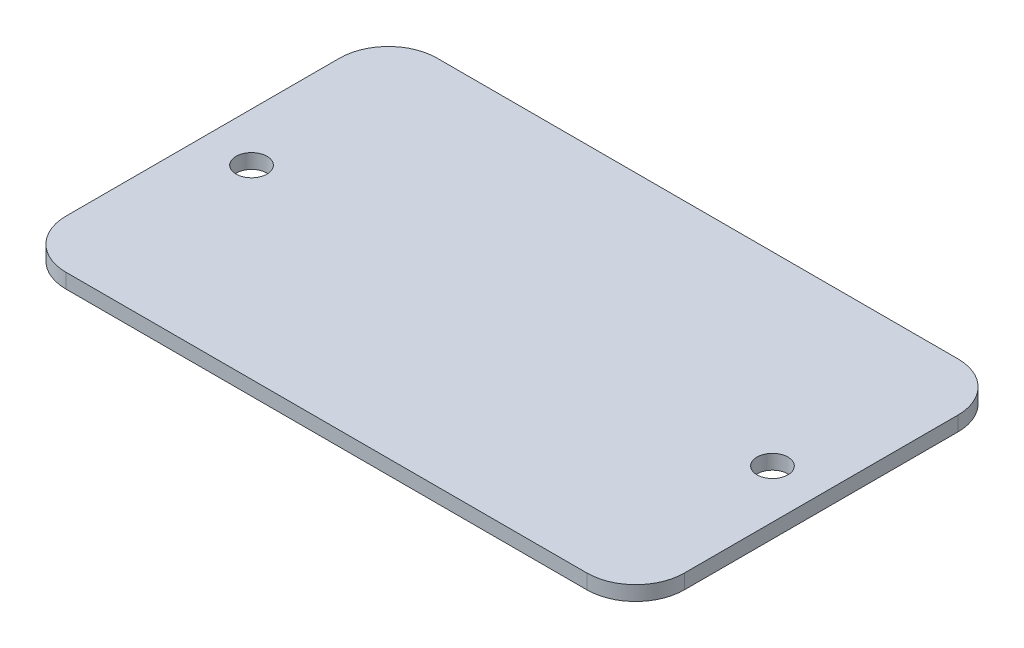
ISO-10303-21;
HEADER;
FILE_DESCRIPTION(('STEP AP214'),'2;1');
FILE_NAME('part.step','',(''),(''),'','','');
FILE_SCHEMA(('AUTOMOTIVE_DESIGN { 1 0 10303 214 1 1 1 1 }'));
ENDSEC;
DATA;
#1=APPLICATION_CONTEXT('core data for automotive mechanical design processes');
#2=APPLICATION_PROTOCOL_DEFINITION('international standard','automotive_design',2000,#1);
#3=PRODUCT_CONTEXT('',#1,'mechanical');
#4=PRODUCT('Part','Part','',(#3));
#5=PRODUCT_RELATED_PRODUCT_CATEGORY('part','',(#4));
#6=PRODUCT_DEFINITION_FORMATION('','',#4);
#7=PRODUCT_DEFINITION_CONTEXT('part definition',#1,'design');
#8=PRODUCT_DEFINITION('design','',#6,#7);
#9=PRODUCT_DEFINITION_SHAPE('','',#8);
#10=(LENGTH_UNIT() NAMED_UNIT(*) SI_UNIT(.MILLI.,.METRE.));
#11=(NAMED_UNIT(*) PLANE_ANGLE_UNIT() SI_UNIT($,.RADIAN.));
#12=(NAMED_UNIT(*) SI_UNIT($,.STERADIAN.) SOLID_ANGLE_UNIT());
#13=UNCERTAINTY_MEASURE_WITH_UNIT(LENGTH_MEASURE(1.E-05),#10,'distance_accuracy_value','');
#14=(GEOMETRIC_REPRESENTATION_CONTEXT(3) GLOBAL_UNCERTAINTY_ASSIGNED_CONTEXT((#13)) GLOBAL_UNIT_ASSIGNED_CONTEXT((#10,
#11,#12)) REPRESENTATION_CONTEXT('',''));
#15=CARTESIAN_POINT('',(0.,0.,0.));
#16=DIRECTION('',(0.,0.,1.));
#17=DIRECTION('',(1.,0.,0.));
#18=AXIS2_PLACEMENT_3D('',#15,#16,#17);
#19=CARTESIAN_POINT('',(53.5,3.,-28.1));
#20=DIRECTION('',(0.,-1.,0.));
#21=DIRECTION('',(0.,0.,-1.));
#22=AXIS2_PLACEMENT_3D('',#19,#20,#21);
#23=CYLINDRICAL_SURFACE('',#22,10.);
#24=CARTESIAN_POINT('',(53.5,0.,-28.1));
#25=DIRECTION('',(0.,1.,0.));
#26=DIRECTION('',(0.,0.,-1.));
#27=AXIS2_PLACEMENT_3D('',#24,#25,#26);
#28=CIRCLE('',#27,10.);
#29=CARTESIAN_POINT('',(63.5,0.,-28.0999999999999));
#30=VERTEX_POINT('',#29);
#31=CARTESIAN_POINT('',(53.4999999999999,0.,-38.1));
#32=VERTEX_POINT('',#31);
#33=EDGE_CURVE('E129',#30,#32,#28,.T.);
#34=ORIENTED_EDGE('',*,*,#33,.T.);
#35=DIRECTION('',(0.,-1.,0.));
#36=VECTOR('',#35,1.);
#37=CARTESIAN_POINT('',(53.4999999999999,3.,-38.1));
#38=LINE('',#37,#36);
#39=CARTESIAN_POINT('',(53.4999999999999,3.,-38.1));
#40=VERTEX_POINT('',#39);
#41=EDGE_CURVE('E11',#40,#32,#38,.T.);
#42=ORIENTED_EDGE('',*,*,#41,.F.);
#43=CARTESIAN_POINT('',(53.5,3.,-28.1));
#44=DIRECTION('',(0.,1.,0.));
#45=DIRECTION('',(0.,0.,-1.));
#46=AXIS2_PLACEMENT_3D('',#43,#44,#45);
#47=CIRCLE('',#46,10.);
#48=CARTESIAN_POINT('',(63.5,3.,-28.0999999999999));
#49=VERTEX_POINT('',#48);
#50=EDGE_CURVE('E144',#49,#40,#47,.T.);
#51=ORIENTED_EDGE('',*,*,#50,.F.);
#52=DIRECTION('',(0.,-1.,0.));
#53=VECTOR('',#52,1.);
#54=CARTESIAN_POINT('',(63.5,3.,-28.0999999999999));
#55=LINE('',#54,#53);
#56=EDGE_CURVE('E125',#49,#30,#55,.T.);
#57=ORIENTED_EDGE('',*,*,#56,.T.);
#58=EDGE_LOOP('',(#34,#42,#51,#57));
#59=FACE_BOUND('',#58,.T.);
#60=ADVANCED_FACE('F33',(#59),#23,.T.);
#61=CARTESIAN_POINT('',(-53.5,3.,-38.1));
#62=DIRECTION('',(0.,0.,1.));
#63=DIRECTION('',(1.,0.,0.));
#64=AXIS2_PLACEMENT_3D('',#61,#62,#63);
#65=PLANE('',#64);
#66=DIRECTION('',(-1.,0.,0.));
#67=VECTOR('',#66,1.);
#68=CARTESIAN_POINT('',(-53.5,0.,-38.1));
#69=LINE('',#68,#67);
#70=CARTESIAN_POINT('',(-53.5,0.,-38.1));
#71=VERTEX_POINT('',#70);
#72=EDGE_CURVE('E132',#32,#71,#69,.T.);
#73=ORIENTED_EDGE('',*,*,#72,.T.);
#74=DIRECTION('',(0.,-1.,0.));
#75=VECTOR('',#74,1.);
#76=CARTESIAN_POINT('',(-53.5,3.,-38.1));
#77=LINE('',#76,#75);
#78=CARTESIAN_POINT('',(-53.5,3.,-38.1));
#79=VERTEX_POINT('',#78);
#80=EDGE_CURVE('E41',#79,#71,#77,.T.);
#81=ORIENTED_EDGE('',*,*,#80,.F.);
#82=DIRECTION('',(-1.,0.,0.));
#83=VECTOR('',#82,1.);
#84=CARTESIAN_POINT('',(-53.5,3.,-38.1));
#85=LINE('',#84,#83);
#86=EDGE_CURVE('E92',#40,#79,#85,.T.);
#87=ORIENTED_EDGE('',*,*,#86,.F.);
#88=ORIENTED_EDGE('',*,*,#41,.T.);
#89=EDGE_LOOP('',(#73,#81,#87,#88));
#90=FACE_BOUND('',#89,.T.);
#91=ADVANCED_FACE('F213',(#90),#65,.F.);
#92=CARTESIAN_POINT('',(-53.5,3.,-28.1));
#93=DIRECTION('',(0.,-1.,0.));
#94=DIRECTION('',(0.,0.,-1.));
#95=AXIS2_PLACEMENT_3D('',#92,#93,#94);
#96=CYLINDRICAL_SURFACE('',#95,10.);
#97=CARTESIAN_POINT('',(-53.5,0.,-28.1));
#98=DIRECTION('',(0.,1.,0.));
#99=DIRECTION('',(0.,0.,-1.));
#100=AXIS2_PLACEMENT_3D('',#97,#98,#99);
#101=CIRCLE('',#100,10.);
#102=CARTESIAN_POINT('',(-63.5,0.,-28.0999999999999));
#103=VERTEX_POINT('',#102);
#104=EDGE_CURVE('E135',#71,#103,#101,.T.);
#105=ORIENTED_EDGE('',*,*,#104,.T.);
#106=DIRECTION('',(0.,-1.,0.));
#107=VECTOR('',#106,1.);
#108=CARTESIAN_POINT('',(-63.5,3.,-28.0999999999999));
#109=LINE('',#108,#107);
#110=CARTESIAN_POINT('',(-63.5,3.,-28.0999999999999));
#111=VERTEX_POINT('',#110);
#112=EDGE_CURVE('E151',#111,#103,#109,.T.);
#113=ORIENTED_EDGE('',*,*,#112,.F.);
#114=CARTESIAN_POINT('',(-53.5,3.,-28.1));
#115=DIRECTION('',(0.,1.,0.));
#116=DIRECTION('',(0.,0.,-1.));
#117=AXIS2_PLACEMENT_3D('',#114,#115,#116);
#118=CIRCLE('',#117,10.);
#119=EDGE_CURVE('E159',#79,#111,#118,.T.);
#120=ORIENTED_EDGE('',*,*,#119,.F.);
#121=ORIENTED_EDGE('',*,*,#80,.T.);
#122=EDGE_LOOP('',(#105,#113,#120,#121));
#123=FACE_BOUND('',#122,.T.);
#124=ADVANCED_FACE('F157',(#123),#96,.T.);
#125=CARTESIAN_POINT('',(-63.5,3.,28.0999999999999));
#126=DIRECTION('',(1.,0.,0.));
#127=DIRECTION('',(0.,0.,-1.));
#128=AXIS2_PLACEMENT_3D('',#125,#126,#127);
#129=PLANE('',#128);
#130=DIRECTION('',(0.,0.,1.));
#131=VECTOR('',#130,1.);
#132=CARTESIAN_POINT('',(-63.5,0.,28.0999999999999));
#133=LINE('',#132,#131);
#134=CARTESIAN_POINT('',(-63.5,0.,28.0999999999999));
#135=VERTEX_POINT('',#134);
#136=EDGE_CURVE('E137',#103,#135,#133,.T.);
#137=ORIENTED_EDGE('',*,*,#136,.T.);
#138=DIRECTION('',(0.,-1.,0.));
#139=VECTOR('',#138,1.);
#140=CARTESIAN_POINT('',(-63.5,3.,28.0999999999999));
#141=LINE('',#140,#139);
#142=CARTESIAN_POINT('',(-63.5,3.,28.0999999999999));
#143=VERTEX_POINT('',#142);
#144=EDGE_CURVE('E148',#143,#135,#141,.T.);
#145=ORIENTED_EDGE('',*,*,#144,.F.);
#146=DIRECTION('',(0.,0.,1.));
#147=VECTOR('',#146,1.);
#148=CARTESIAN_POINT('',(-63.5,3.,28.0999999999999));
#149=LINE('',#148,#147);
#150=EDGE_CURVE('E171',#111,#143,#149,.T.);
#151=ORIENTED_EDGE('',*,*,#150,.F.);
#152=ORIENTED_EDGE('',*,*,#112,.T.);
#153=EDGE_LOOP('',(#137,#145,#151,#152));
#154=FACE_BOUND('',#153,.T.);
#155=ADVANCED_FACE('F167',(#154),#129,.F.);
#156=CARTESIAN_POINT('',(-53.5,3.,28.1));
#157=DIRECTION('',(0.,-1.,0.));
#158=DIRECTION('',(0.,0.,-1.));
#159=AXIS2_PLACEMENT_3D('',#156,#157,#158);
#160=CYLINDRICAL_SURFACE('',#159,10.);
#161=CARTESIAN_POINT('',(-53.5,0.,28.1));
#162=DIRECTION('',(0.,1.,0.));
#163=DIRECTION('',(0.,0.,-1.));
#164=AXIS2_PLACEMENT_3D('',#161,#162,#163);
#165=CIRCLE('',#164,10.);
#166=CARTESIAN_POINT('',(-53.5,0.,38.1));
#167=VERTEX_POINT('',#166);
#168=EDGE_CURVE('E139',#135,#167,#165,.T.);
#169=ORIENTED_EDGE('',*,*,#168,.T.);
#170=DIRECTION('',(0.,-1.,0.));
#171=VECTOR('',#170,1.);
#172=CARTESIAN_POINT('',(-53.5,3.,38.1));
#173=LINE('',#172,#171);
#174=CARTESIAN_POINT('',(-53.5,3.,38.1));
#175=VERTEX_POINT('',#174);
#176=EDGE_CURVE('E120',#175,#167,#173,.T.);
#177=ORIENTED_EDGE('',*,*,#176,.F.);
#178=CARTESIAN_POINT('',(-53.5,3.,28.1));
#179=DIRECTION('',(0.,1.,0.));
#180=DIRECTION('',(0.,0.,-1.));
#181=AXIS2_PLACEMENT_3D('',#178,#179,#180);
#182=CIRCLE('',#181,10.);
#183=EDGE_CURVE('E111',#143,#175,#182,.T.);
#184=ORIENTED_EDGE('',*,*,#183,.F.);
#185=ORIENTED_EDGE('',*,*,#144,.T.);
#186=EDGE_LOOP('',(#169,#177,#184,#185));
#187=FACE_BOUND('',#186,.T.);
#188=ADVANCED_FACE('F170',(#187),#160,.T.);
#189=CARTESIAN_POINT('',(-53.5,3.,38.1));
#190=DIRECTION('',(0.,0.,-1.));
#191=DIRECTION('',(-1.,0.,0.));
#192=AXIS2_PLACEMENT_3D('',#189,#190,#191);
#193=PLANE('',#192);
#194=DIRECTION('',(1.,0.,0.));
#195=VECTOR('',#194,1.);
#196=CARTESIAN_POINT('',(-53.5,0.,38.1));
#197=LINE('',#196,#195);
#198=CARTESIAN_POINT('',(53.4999999999999,0.,38.1));
#199=VERTEX_POINT('',#198);
#200=EDGE_CURVE('E119',#167,#199,#197,.T.);
#201=ORIENTED_EDGE('',*,*,#200,.T.);
#202=DIRECTION('',(0.,-1.,0.));
#203=VECTOR('',#202,1.);
#204=CARTESIAN_POINT('',(53.4999999999999,3.,38.1));
#205=LINE('',#204,#203);
#206=CARTESIAN_POINT('',(53.4999999999999,3.,38.1));
#207=VERTEX_POINT('',#206);
#208=EDGE_CURVE('E116',#207,#199,#205,.T.);
#209=ORIENTED_EDGE('',*,*,#208,.F.);
#210=DIRECTION('',(1.,0.,0.));
#211=VECTOR('',#210,1.);
#212=CARTESIAN_POINT('',(-53.5,3.,38.1));
#213=LINE('',#212,#211);
#214=EDGE_CURVE('E105',#175,#207,#213,.T.);
#215=ORIENTED_EDGE('',*,*,#214,.F.);
#216=ORIENTED_EDGE('',*,*,#176,.T.);
#217=EDGE_LOOP('',(#201,#209,#215,#216));
#218=FACE_BOUND('',#217,.T.);
#219=ADVANCED_FACE('F117',(#218),#193,.F.);
#220=CARTESIAN_POINT('',(53.5,3.,28.1));
#221=DIRECTION('',(0.,-1.,0.));
#222=DIRECTION('',(0.,0.,-1.));
#223=AXIS2_PLACEMENT_3D('',#220,#221,#222);
#224=CYLINDRICAL_SURFACE('',#223,10.);
#225=CARTESIAN_POINT('',(53.5,0.,28.1));
#226=DIRECTION('',(0.,1.,0.));
#227=DIRECTION('',(0.,0.,1.));
#228=AXIS2_PLACEMENT_3D('',#225,#226,#227);
#229=CIRCLE('',#228,10.);
#230=CARTESIAN_POINT('',(63.5,0.,28.0999999999999));
#231=VERTEX_POINT('',#230);
#232=EDGE_CURVE('E78',#199,#231,#229,.T.);
#233=ORIENTED_EDGE('',*,*,#232,.T.);
#234=DIRECTION('',(0.,-1.,0.));
#235=VECTOR('',#234,1.);
#236=CARTESIAN_POINT('',(63.5,3.,28.0999999999999));
#237=LINE('',#236,#235);
#238=CARTESIAN_POINT('',(63.5,3.,28.0999999999999));
#239=VERTEX_POINT('',#238);
#240=EDGE_CURVE('E121',#239,#231,#237,.T.);
#241=ORIENTED_EDGE('',*,*,#240,.F.);
#242=CARTESIAN_POINT('',(53.5,3.,28.1));
#243=DIRECTION('',(0.,1.,0.));
#244=DIRECTION('',(0.,0.,1.));
#245=AXIS2_PLACEMENT_3D('',#242,#243,#244);
#246=CIRCLE('',#245,10.);
#247=EDGE_CURVE('E109',#207,#239,#246,.T.);
#248=ORIENTED_EDGE('',*,*,#247,.F.);
#249=ORIENTED_EDGE('',*,*,#208,.T.);
#250=EDGE_LOOP('',(#233,#241,#248,#249));
#251=FACE_BOUND('',#250,.T.);
#252=ADVANCED_FACE('F123',(#251),#224,.T.);
#253=CARTESIAN_POINT('',(63.5,3.,28.0999999999999));
#254=DIRECTION('',(-1.,0.,0.));
#255=DIRECTION('',(0.,0.,1.));
#256=AXIS2_PLACEMENT_3D('',#253,#254,#255);
#257=PLANE('',#256);
#258=DIRECTION('',(0.,0.,-1.));
#259=VECTOR('',#258,1.);
#260=CARTESIAN_POINT('',(63.5,0.,28.0999999999999));
#261=LINE('',#260,#259);
#262=EDGE_CURVE('E84',#231,#30,#261,.T.);
#263=ORIENTED_EDGE('',*,*,#262,.T.);
#264=ORIENTED_EDGE('',*,*,#56,.F.);
#265=DIRECTION('',(0.,0.,-1.));
#266=VECTOR('',#265,1.);
#267=CARTESIAN_POINT('',(63.5,3.,28.0999999999999));
#268=LINE('',#267,#266);
#269=EDGE_CURVE('E49',#239,#49,#268,.T.);
#270=ORIENTED_EDGE('',*,*,#269,.F.);
#271=ORIENTED_EDGE('',*,*,#240,.T.);
#272=EDGE_LOOP('',(#263,#264,#270,#271));
#273=FACE_BOUND('',#272,.T.);
#274=ADVANCED_FACE('F200',(#273),#257,.F.);
#275=CARTESIAN_POINT('',(53.5,3.,-28.1));
#276=DIRECTION('',(0.,-1.,0.));
#277=DIRECTION('',(0.,0.,-1.));
#278=AXIS2_PLACEMENT_3D('',#275,#276,#277);
#279=PLANE('',#278);
#280=CARTESIAN_POINT('',(53.5,3.,0.));
#281=DIRECTION('',(0.,1.,0.));
#282=DIRECTION('',(0.,0.,1.));
#283=AXIS2_PLACEMENT_3D('',#280,#281,#282);
#284=CIRCLE('',#283,3.175);
#285=CARTESIAN_POINT('',(53.5,3.,3.175));
#286=VERTEX_POINT('',#285);
#287=EDGE_CURVE('E183',#286,#286,#284,.T.);
#288=ORIENTED_EDGE('',*,*,#287,.F.);
#289=EDGE_LOOP('',(#288));
#290=FACE_BOUND('',#289,.T.);
#291=CARTESIAN_POINT('',(-53.5,3.,0.));
#292=DIRECTION('',(0.,1.,0.));
#293=DIRECTION('',(0.,0.,1.));
#294=AXIS2_PLACEMENT_3D('',#291,#292,#293);
#295=CIRCLE('',#294,3.175);
#296=CARTESIAN_POINT('',(-53.5,3.,3.17499999999999));
#297=VERTEX_POINT('',#296);
#298=EDGE_CURVE('E177',#297,#297,#295,.T.);
#299=ORIENTED_EDGE('',*,*,#298,.F.);
#300=EDGE_LOOP('',(#299));
#301=FACE_BOUND('',#300,.T.);
#302=ORIENTED_EDGE('',*,*,#50,.T.);
#303=ORIENTED_EDGE('',*,*,#86,.T.);
#304=ORIENTED_EDGE('',*,*,#119,.T.);
#305=ORIENTED_EDGE('',*,*,#150,.T.);
#306=ORIENTED_EDGE('',*,*,#183,.T.);
#307=ORIENTED_EDGE('',*,*,#214,.T.);
#308=ORIENTED_EDGE('',*,*,#247,.T.);
#309=ORIENTED_EDGE('',*,*,#269,.T.);
#310=EDGE_LOOP('',(#302,#303,#304,#305,#306,#307,#308,#309));
#311=FACE_BOUND('',#310,.T.);
#312=ADVANCED_FACE('F107',(#290,#301,#311),#279,.F.);
#313=CARTESIAN_POINT('',(53.5,0.,-28.1));
#314=DIRECTION('',(0.,-1.,0.));
#315=DIRECTION('',(0.,0.,-1.));
#316=AXIS2_PLACEMENT_3D('',#313,#314,#315);
#317=PLANE('',#316);
#318=CARTESIAN_POINT('',(53.5,0.,0.));
#319=DIRECTION('',(0.,1.,0.));
#320=DIRECTION('',(0.,0.,1.));
#321=AXIS2_PLACEMENT_3D('',#318,#319,#320);
#322=CIRCLE('',#321,3.175);
#323=CARTESIAN_POINT('',(53.5,0.,3.175));
#324=VERTEX_POINT('',#323);
#325=EDGE_CURVE('E180',#324,#324,#322,.T.);
#326=ORIENTED_EDGE('',*,*,#325,.T.);
#327=EDGE_LOOP('',(#326));
#328=FACE_BOUND('',#327,.T.);
#329=CARTESIAN_POINT('',(-53.5,0.,0.));
#330=DIRECTION('',(0.,1.,0.));
#331=DIRECTION('',(0.,0.,1.));
#332=AXIS2_PLACEMENT_3D('',#329,#330,#331);
#333=CIRCLE('',#332,3.175);
#334=CARTESIAN_POINT('',(-53.5,0.,3.17499999999999));
#335=VERTEX_POINT('',#334);
#336=EDGE_CURVE('E133',#335,#335,#333,.T.);
#337=ORIENTED_EDGE('',*,*,#336,.T.);
#338=EDGE_LOOP('',(#337));
#339=FACE_BOUND('',#338,.T.);
#340=ORIENTED_EDGE('',*,*,#33,.F.);
#341=ORIENTED_EDGE('',*,*,#262,.F.);
#342=ORIENTED_EDGE('',*,*,#232,.F.);
#343=ORIENTED_EDGE('',*,*,#200,.F.);
#344=ORIENTED_EDGE('',*,*,#168,.F.);
#345=ORIENTED_EDGE('',*,*,#136,.F.);
#346=ORIENTED_EDGE('',*,*,#104,.F.);
#347=ORIENTED_EDGE('',*,*,#72,.F.);
#348=EDGE_LOOP('',(#340,#341,#342,#343,#344,#345,#346,#347));
#349=FACE_BOUND('',#348,.T.);
#350=ADVANCED_FACE('F163',(#328,#339,#349),#317,.T.);
#351=CARTESIAN_POINT('',(-53.5,0.,0.));
#352=DIRECTION('',(0.,1.,0.));
#353=DIRECTION('',(0.,0.,1.));
#354=AXIS2_PLACEMENT_3D('',#351,#352,#353);
#355=CYLINDRICAL_SURFACE('',#354,3.175);
#356=ORIENTED_EDGE('',*,*,#336,.F.);
#357=EDGE_LOOP('',(#356));
#358=FACE_BOUND('',#357,.T.);
#359=ORIENTED_EDGE('',*,*,#298,.T.);
#360=EDGE_LOOP('',(#359));
#361=FACE_BOUND('',#360,.T.);
#362=ADVANCED_FACE('F194',(#358,#361),#355,.F.);
#363=CARTESIAN_POINT('',(53.5,0.,0.));
#364=DIRECTION('',(0.,1.,0.));
#365=DIRECTION('',(0.,0.,1.));
#366=AXIS2_PLACEMENT_3D('',#363,#364,#365);
#367=CYLINDRICAL_SURFACE('',#366,3.175);
#368=ORIENTED_EDGE('',*,*,#325,.F.);
#369=EDGE_LOOP('',(#368));
#370=FACE_BOUND('',#369,.T.);
#371=ORIENTED_EDGE('',*,*,#287,.T.);
#372=EDGE_LOOP('',(#371));
#373=FACE_BOUND('',#372,.T.);
#374=ADVANCED_FACE('F191',(#370,#373),#367,.F.);
#375=CLOSED_SHELL('',(#60,#91,#124,#155,#188,#219,#252,#274,#312,#350,#362,#374));
#376=MANIFOLD_SOLID_BREP('B2',#375);
#377=ADVANCED_BREP_SHAPE_REPRESENTATION('',(#18,#376),#14);
#378=SHAPE_DEFINITION_REPRESENTATION(#9,#377);
ENDSEC;
END-ISO-10303-21;
